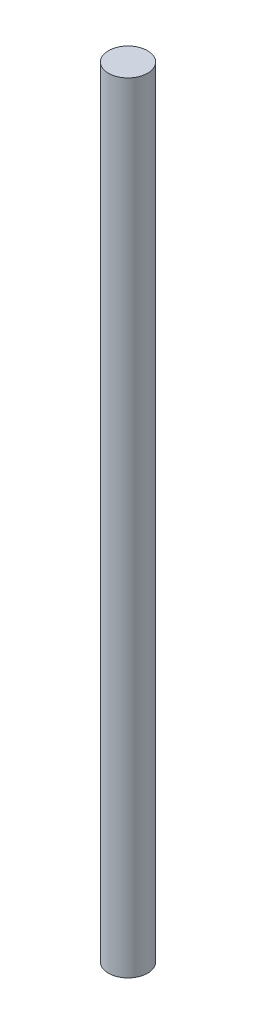
ISO-10303-21;
HEADER;
FILE_DESCRIPTION(('STEP AP214'),'2;1');
FILE_NAME('part.step','',(''),(''),'','','');
FILE_SCHEMA(('AUTOMOTIVE_DESIGN { 1 0 10303 214 1 1 1 1 }'));
ENDSEC;
DATA;
#1=APPLICATION_CONTEXT('core data for automotive mechanical design processes');
#2=APPLICATION_PROTOCOL_DEFINITION('international standard','automotive_design',2000,#1);
#3=PRODUCT_CONTEXT('',#1,'mechanical');
#4=PRODUCT('Part','Part','',(#3));
#5=PRODUCT_RELATED_PRODUCT_CATEGORY('part','',(#4));
#6=PRODUCT_DEFINITION_FORMATION('','',#4);
#7=PRODUCT_DEFINITION_CONTEXT('part definition',#1,'design');
#8=PRODUCT_DEFINITION('design','',#6,#7);
#9=PRODUCT_DEFINITION_SHAPE('','',#8);
#10=(LENGTH_UNIT() NAMED_UNIT(*) SI_UNIT(.MILLI.,.METRE.));
#11=(NAMED_UNIT(*) PLANE_ANGLE_UNIT() SI_UNIT($,.RADIAN.));
#12=(NAMED_UNIT(*) SI_UNIT($,.STERADIAN.) SOLID_ANGLE_UNIT());
#13=UNCERTAINTY_MEASURE_WITH_UNIT(LENGTH_MEASURE(1.E-05),#10,'distance_accuracy_value','');
#14=(GEOMETRIC_REPRESENTATION_CONTEXT(3) GLOBAL_UNCERTAINTY_ASSIGNED_CONTEXT((#13)) GLOBAL_UNIT_ASSIGNED_CONTEXT((#10,
#11,#12)) REPRESENTATION_CONTEXT('',''));
#15=CARTESIAN_POINT('',(0.,0.,0.));
#16=DIRECTION('',(0.,0.,1.));
#17=DIRECTION('',(1.,0.,0.));
#18=AXIS2_PLACEMENT_3D('',#15,#16,#17);
#19=CARTESIAN_POINT('',(0.,1561.37,0.));
#20=DIRECTION('',(0.,1.,0.));
#21=DIRECTION('',(0.,0.,1.));
#22=AXIS2_PLACEMENT_3D('',#19,#20,#21);
#23=PLANE('',#22);
#24=CARTESIAN_POINT('',(0.,1561.37,0.));
#25=DIRECTION('',(0.,-1.,0.));
#26=DIRECTION('',(0.,0.,-1.));
#27=AXIS2_PLACEMENT_3D('',#24,#25,#26);
#28=CIRCLE('',#27,39.18);
#29=CARTESIAN_POINT('',(0.,1561.37,-39.18));
#30=VERTEX_POINT('',#29);
#31=EDGE_CURVE('E10',#30,#30,#28,.T.);
#32=ORIENTED_EDGE('',*,*,#31,.F.);
#33=EDGE_LOOP('',(#32));
#34=FACE_BOUND('',#33,.T.);
#35=ADVANCED_FACE('F37',(#34),#23,.T.);
#36=CARTESIAN_POINT('',(0.,0.,0.));
#37=DIRECTION('',(0.,-1.,0.));
#38=DIRECTION('',(0.,0.,-1.));
#39=AXIS2_PLACEMENT_3D('',#36,#37,#38);
#40=CYLINDRICAL_SURFACE('',#39,39.1800000000001);
#41=ORIENTED_EDGE('',*,*,#31,.T.);
#42=EDGE_LOOP('',(#41));
#43=FACE_BOUND('',#42,.T.);
#44=CARTESIAN_POINT('',(0.,0.,0.));
#45=DIRECTION('',(0.,-1.,0.));
#46=DIRECTION('',(0.,0.,-1.));
#47=AXIS2_PLACEMENT_3D('',#44,#45,#46);
#48=CIRCLE('',#47,39.1800000000002);
#49=CARTESIAN_POINT('',(0.,0.,-39.1800000000002));
#50=VERTEX_POINT('',#49);
#51=EDGE_CURVE('E44',#50,#50,#48,.T.);
#52=ORIENTED_EDGE('',*,*,#51,.F.);
#53=EDGE_LOOP('',(#52));
#54=FACE_BOUND('',#53,.T.);
#55=ADVANCED_FACE('F53',(#43,#54),#40,.T.);
#56=CARTESIAN_POINT('',(39.1800000000002,0.,0.));
#57=DIRECTION('',(0.,-1.,0.));
#58=DIRECTION('',(0.,0.,-1.));
#59=AXIS2_PLACEMENT_3D('',#56,#57,#58);
#60=PLANE('',#59);
#61=ORIENTED_EDGE('',*,*,#51,.T.);
#62=EDGE_LOOP('',(#61));
#63=FACE_BOUND('',#62,.T.);
#64=ADVANCED_FACE('F51',(#63),#60,.T.);
#65=CLOSED_SHELL('',(#35,#55,#64));
#66=MANIFOLD_SOLID_BREP('B2',#65);
#67=ADVANCED_BREP_SHAPE_REPRESENTATION('',(#18,#66),#14);
#68=SHAPE_DEFINITION_REPRESENTATION(#9,#67);
ENDSEC;
END-ISO-10303-21;
